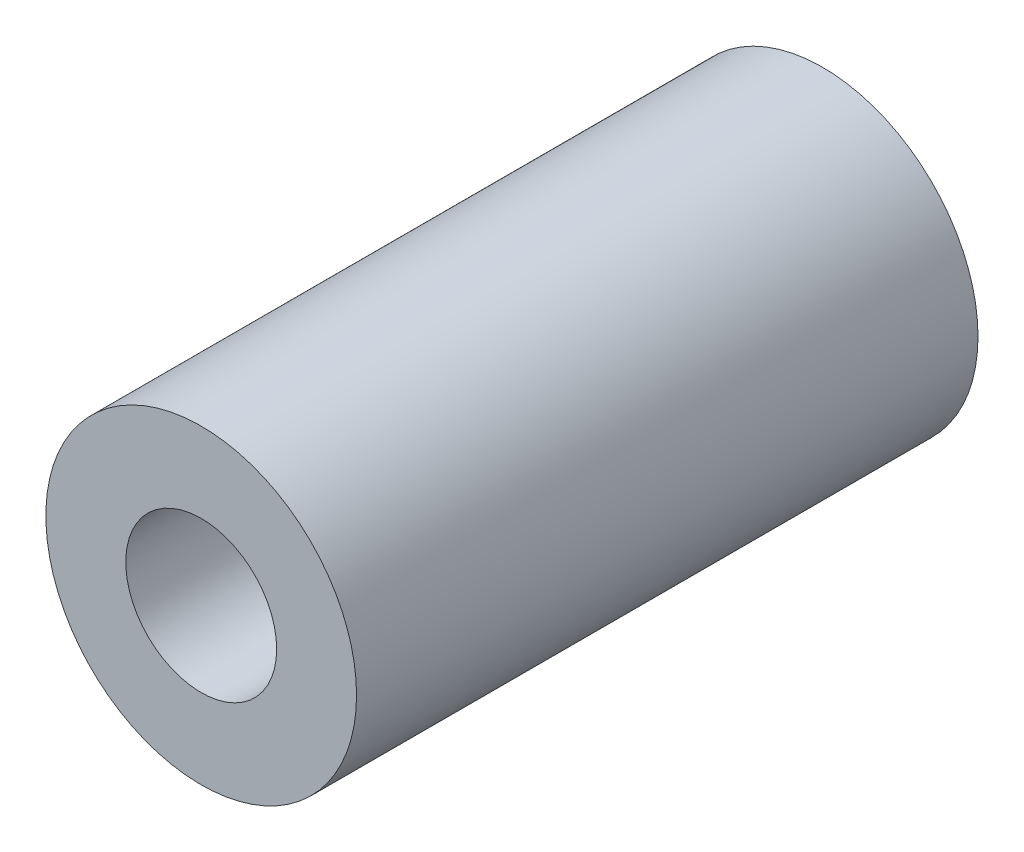
ISO-10303-21;
HEADER;
FILE_DESCRIPTION(('STEP AP214'),'2;1');
FILE_NAME('part.step','',(''),(''),'','','');
FILE_SCHEMA(('AUTOMOTIVE_DESIGN { 1 0 10303 214 1 1 1 1 }'));
ENDSEC;
DATA;
#1=APPLICATION_CONTEXT('core data for automotive mechanical design processes');
#2=APPLICATION_PROTOCOL_DEFINITION('international standard','automotive_design',2000,#1);
#3=PRODUCT_CONTEXT('',#1,'mechanical');
#4=PRODUCT('Part','Part','',(#3));
#5=PRODUCT_RELATED_PRODUCT_CATEGORY('part','',(#4));
#6=PRODUCT_DEFINITION_FORMATION('','',#4);
#7=PRODUCT_DEFINITION_CONTEXT('part definition',#1,'design');
#8=PRODUCT_DEFINITION('design','',#6,#7);
#9=PRODUCT_DEFINITION_SHAPE('','',#8);
#10=(LENGTH_UNIT() NAMED_UNIT(*) SI_UNIT(.MILLI.,.METRE.));
#11=(NAMED_UNIT(*) PLANE_ANGLE_UNIT() SI_UNIT($,.RADIAN.));
#12=(NAMED_UNIT(*) SI_UNIT($,.STERADIAN.) SOLID_ANGLE_UNIT());
#13=UNCERTAINTY_MEASURE_WITH_UNIT(LENGTH_MEASURE(1.E-05),#10,'distance_accuracy_value','');
#14=(GEOMETRIC_REPRESENTATION_CONTEXT(3) GLOBAL_UNCERTAINTY_ASSIGNED_CONTEXT((#13)) GLOBAL_UNIT_ASSIGNED_CONTEXT((#10,
#11,#12)) REPRESENTATION_CONTEXT('',''));
#15=CARTESIAN_POINT('',(0.,0.,0.));
#16=DIRECTION('',(0.,0.,1.));
#17=DIRECTION('',(1.,0.,0.));
#18=AXIS2_PLACEMENT_3D('',#15,#16,#17);
#19=CARTESIAN_POINT('',(0.,0.,14.));
#20=DIRECTION('',(0.,0.,1.));
#21=DIRECTION('',(1.,0.,0.));
#22=AXIS2_PLACEMENT_3D('',#19,#20,#21);
#23=PLANE('',#22);
#24=CARTESIAN_POINT('',(0.,0.,14.));
#25=DIRECTION('',(0.,0.,1.));
#26=DIRECTION('',(1.,0.,0.));
#27=AXIS2_PLACEMENT_3D('',#24,#25,#26);
#28=CIRCLE('',#27,3.5);
#29=CARTESIAN_POINT('',(3.5,0.,14.));
#30=VERTEX_POINT('',#29);
#31=EDGE_CURVE('E10',#30,#30,#28,.T.);
#32=ORIENTED_EDGE('',*,*,#31,.T.);
#33=EDGE_LOOP('',(#32));
#34=FACE_BOUND('',#33,.T.);
#35=CARTESIAN_POINT('',(0.,0.,14.));
#36=DIRECTION('',(0.,0.,1.));
#37=DIRECTION('',(1.,0.,0.));
#38=AXIS2_PLACEMENT_3D('',#35,#36,#37);
#39=CIRCLE('',#38,1.7);
#40=CARTESIAN_POINT('',(1.7,0.,14.));
#41=VERTEX_POINT('',#40);
#42=EDGE_CURVE('E42',#41,#41,#39,.T.);
#43=ORIENTED_EDGE('',*,*,#42,.F.);
#44=EDGE_LOOP('',(#43));
#45=FACE_BOUND('',#44,.T.);
#46=ADVANCED_FACE('F31',(#34,#45),#23,.T.);
#47=CARTESIAN_POINT('',(0.,0.,0.));
#48=DIRECTION('',(0.,0.,1.));
#49=DIRECTION('',(1.,0.,0.));
#50=AXIS2_PLACEMENT_3D('',#47,#48,#49);
#51=PLANE('',#50);
#52=CARTESIAN_POINT('',(0.,0.,0.));
#53=DIRECTION('',(0.,0.,1.));
#54=DIRECTION('',(1.,0.,0.));
#55=AXIS2_PLACEMENT_3D('',#52,#53,#54);
#56=CIRCLE('',#55,3.5);
#57=CARTESIAN_POINT('',(3.5,0.,0.));
#58=VERTEX_POINT('',#57);
#59=EDGE_CURVE('E35',#58,#58,#56,.T.);
#60=ORIENTED_EDGE('',*,*,#59,.F.);
#61=EDGE_LOOP('',(#60));
#62=FACE_BOUND('',#61,.T.);
#63=CARTESIAN_POINT('',(0.,0.,0.));
#64=DIRECTION('',(0.,0.,1.));
#65=DIRECTION('',(1.,0.,0.));
#66=AXIS2_PLACEMENT_3D('',#63,#64,#65);
#67=CIRCLE('',#66,1.7);
#68=CARTESIAN_POINT('',(1.7,0.,0.));
#69=VERTEX_POINT('',#68);
#70=EDGE_CURVE('E44',#69,#69,#67,.T.);
#71=ORIENTED_EDGE('',*,*,#70,.T.);
#72=EDGE_LOOP('',(#71));
#73=FACE_BOUND('',#72,.T.);
#74=ADVANCED_FACE('F54',(#62,#73),#51,.F.);
#75=CARTESIAN_POINT('',(0.,0.,14.));
#76=DIRECTION('',(0.,0.,-1.));
#77=DIRECTION('',(-1.,0.,0.));
#78=AXIS2_PLACEMENT_3D('',#75,#76,#77);
#79=CYLINDRICAL_SURFACE('',#78,3.5);
#80=ORIENTED_EDGE('',*,*,#31,.F.);
#81=EDGE_LOOP('',(#80));
#82=FACE_BOUND('',#81,.T.);
#83=ORIENTED_EDGE('',*,*,#59,.T.);
#84=EDGE_LOOP('',(#83));
#85=FACE_BOUND('',#84,.T.);
#86=ADVANCED_FACE('F33',(#82,#85),#79,.T.);
#87=CARTESIAN_POINT('',(0.,0.,14.));
#88=DIRECTION('',(0.,0.,-1.));
#89=DIRECTION('',(-1.,0.,0.));
#90=AXIS2_PLACEMENT_3D('',#87,#88,#89);
#91=CYLINDRICAL_SURFACE('',#90,1.7);
#92=ORIENTED_EDGE('',*,*,#42,.T.);
#93=EDGE_LOOP('',(#92));
#94=FACE_BOUND('',#93,.T.);
#95=ORIENTED_EDGE('',*,*,#70,.F.);
#96=EDGE_LOOP('',(#95));
#97=FACE_BOUND('',#96,.T.);
#98=ADVANCED_FACE('F50',(#94,#97),#91,.F.);
#99=CLOSED_SHELL('',(#46,#74,#86,#98));
#100=MANIFOLD_SOLID_BREP('B2',#99);
#101=ADVANCED_BREP_SHAPE_REPRESENTATION('',(#18,#100),#14);
#102=SHAPE_DEFINITION_REPRESENTATION(#9,#101);
ENDSEC;
END-ISO-10303-21;
